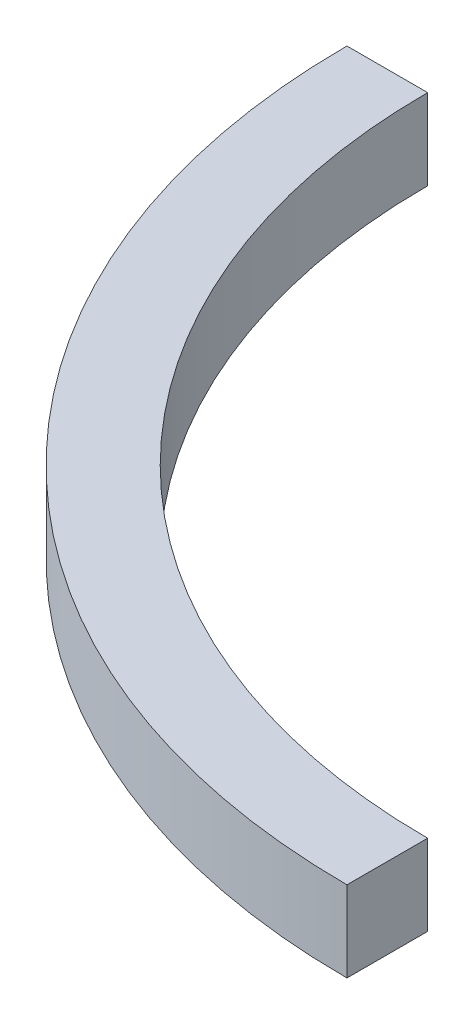
ISO-10303-21;
HEADER;
FILE_DESCRIPTION(('STEP AP214'),'2;1');
FILE_NAME('part.step','',(''),(''),'','','');
FILE_SCHEMA(('AUTOMOTIVE_DESIGN { 1 0 10303 214 1 1 1 1 }'));
ENDSEC;
DATA;
#1=APPLICATION_CONTEXT('core data for automotive mechanical design processes');
#2=APPLICATION_PROTOCOL_DEFINITION('international standard','automotive_design',2000,#1);
#3=PRODUCT_CONTEXT('',#1,'mechanical');
#4=PRODUCT('Part','Part','',(#3));
#5=PRODUCT_RELATED_PRODUCT_CATEGORY('part','',(#4));
#6=PRODUCT_DEFINITION_FORMATION('','',#4);
#7=PRODUCT_DEFINITION_CONTEXT('part definition',#1,'design');
#8=PRODUCT_DEFINITION('design','',#6,#7);
#9=PRODUCT_DEFINITION_SHAPE('','',#8);
#10=(LENGTH_UNIT() NAMED_UNIT(*) SI_UNIT(.MILLI.,.METRE.));
#11=(NAMED_UNIT(*) PLANE_ANGLE_UNIT() SI_UNIT($,.RADIAN.));
#12=(NAMED_UNIT(*) SI_UNIT($,.STERADIAN.) SOLID_ANGLE_UNIT());
#13=UNCERTAINTY_MEASURE_WITH_UNIT(LENGTH_MEASURE(1.E-05),#10,'distance_accuracy_value','');
#14=(GEOMETRIC_REPRESENTATION_CONTEXT(3) GLOBAL_UNCERTAINTY_ASSIGNED_CONTEXT((#13)) GLOBAL_UNIT_ASSIGNED_CONTEXT((#10,
#11,#12)) REPRESENTATION_CONTEXT('',''));
#15=CARTESIAN_POINT('',(0.,0.,0.));
#16=DIRECTION('',(0.,0.,1.));
#17=DIRECTION('',(1.,0.,0.));
#18=AXIS2_PLACEMENT_3D('',#15,#16,#17);
#19=CARTESIAN_POINT('',(0.,3.,0.));
#20=DIRECTION('',(0.,-1.,0.));
#21=DIRECTION('',(0.,0.,-1.));
#22=AXIS2_PLACEMENT_3D('',#19,#20,#21);
#23=CYLINDRICAL_SURFACE('',#22,27.);
#24=CARTESIAN_POINT('',(0.,0.,0.));
#25=DIRECTION('',(0.,1.,0.));
#26=DIRECTION('',(0.,0.,-1.));
#27=AXIS2_PLACEMENT_3D('',#24,#25,#26);
#28=CIRCLE('',#27,27.);
#29=CARTESIAN_POINT('',(-27.,0.,0.));
#30=VERTEX_POINT('',#29);
#31=CARTESIAN_POINT('',(0.,0.,27.));
#32=VERTEX_POINT('',#31);
#33=EDGE_CURVE('E107',#30,#32,#28,.T.);
#34=ORIENTED_EDGE('',*,*,#33,.T.);
#35=DIRECTION('',(0.,-1.,0.));
#36=VECTOR('',#35,1.);
#37=CARTESIAN_POINT('',(0.,3.,27.));
#38=LINE('',#37,#36);
#39=CARTESIAN_POINT('',(0.,3.,27.));
#40=VERTEX_POINT('',#39);
#41=EDGE_CURVE('E11',#40,#32,#38,.T.);
#42=ORIENTED_EDGE('',*,*,#41,.F.);
#43=CARTESIAN_POINT('',(0.,3.,0.));
#44=DIRECTION('',(0.,1.,0.));
#45=DIRECTION('',(0.,0.,-1.));
#46=AXIS2_PLACEMENT_3D('',#43,#44,#45);
#47=CIRCLE('',#46,27.);
#48=CARTESIAN_POINT('',(-27.,3.,0.));
#49=VERTEX_POINT('',#48);
#50=EDGE_CURVE('E91',#49,#40,#47,.T.);
#51=ORIENTED_EDGE('',*,*,#50,.F.);
#52=DIRECTION('',(0.,-1.,0.));
#53=VECTOR('',#52,1.);
#54=CARTESIAN_POINT('',(-27.,3.,0.));
#55=LINE('',#54,#53);
#56=EDGE_CURVE('E103',#49,#30,#55,.T.);
#57=ORIENTED_EDGE('',*,*,#56,.T.);
#58=EDGE_LOOP('',(#34,#42,#51,#57));
#59=FACE_BOUND('',#58,.T.);
#60=ADVANCED_FACE('F39',(#59),#23,.T.);
#61=CARTESIAN_POINT('',(0.,3.,24.));
#62=DIRECTION('',(-1.,0.,0.));
#63=DIRECTION('',(0.,0.,1.));
#64=AXIS2_PLACEMENT_3D('',#61,#62,#63);
#65=PLANE('',#64);
#66=DIRECTION('',(0.,0.,-1.));
#67=VECTOR('',#66,1.);
#68=CARTESIAN_POINT('',(0.,0.,24.));
#69=LINE('',#68,#67);
#70=CARTESIAN_POINT('',(0.,0.,24.));
#71=VERTEX_POINT('',#70);
#72=EDGE_CURVE('E96',#32,#71,#69,.T.);
#73=ORIENTED_EDGE('',*,*,#72,.T.);
#74=DIRECTION('',(0.,-1.,0.));
#75=VECTOR('',#74,1.);
#76=CARTESIAN_POINT('',(0.,3.,24.));
#77=LINE('',#76,#75);
#78=CARTESIAN_POINT('',(0.,3.,24.));
#79=VERTEX_POINT('',#78);
#80=EDGE_CURVE('E48',#79,#71,#77,.T.);
#81=ORIENTED_EDGE('',*,*,#80,.F.);
#82=DIRECTION('',(0.,0.,-1.));
#83=VECTOR('',#82,1.);
#84=CARTESIAN_POINT('',(0.,3.,24.));
#85=LINE('',#84,#83);
#86=EDGE_CURVE('E86',#40,#79,#85,.T.);
#87=ORIENTED_EDGE('',*,*,#86,.F.);
#88=ORIENTED_EDGE('',*,*,#41,.T.);
#89=EDGE_LOOP('',(#73,#81,#87,#88));
#90=FACE_BOUND('',#89,.T.);
#91=ADVANCED_FACE('F95',(#90),#65,.F.);
#92=CARTESIAN_POINT('',(0.,3.,0.));
#93=DIRECTION('',(0.,-1.,0.));
#94=DIRECTION('',(0.,0.,-1.));
#95=AXIS2_PLACEMENT_3D('',#92,#93,#94);
#96=CYLINDRICAL_SURFACE('',#95,24.);
#97=CARTESIAN_POINT('',(0.,0.,0.));
#98=DIRECTION('',(0.,-1.,0.));
#99=DIRECTION('',(0.,0.,-1.));
#100=AXIS2_PLACEMENT_3D('',#97,#98,#99);
#101=CIRCLE('',#100,24.);
#102=CARTESIAN_POINT('',(-24.,0.,0.));
#103=VERTEX_POINT('',#102);
#104=EDGE_CURVE('E73',#71,#103,#101,.T.);
#105=ORIENTED_EDGE('',*,*,#104,.T.);
#106=DIRECTION('',(0.,-1.,0.));
#107=VECTOR('',#106,1.);
#108=CARTESIAN_POINT('',(-24.,3.,0.));
#109=LINE('',#108,#107);
#110=CARTESIAN_POINT('',(-24.,3.,0.));
#111=VERTEX_POINT('',#110);
#112=EDGE_CURVE('E98',#111,#103,#109,.T.);
#113=ORIENTED_EDGE('',*,*,#112,.F.);
#114=CARTESIAN_POINT('',(0.,3.,0.));
#115=DIRECTION('',(0.,-1.,0.));
#116=DIRECTION('',(0.,0.,-1.));
#117=AXIS2_PLACEMENT_3D('',#114,#115,#116);
#118=CIRCLE('',#117,24.);
#119=EDGE_CURVE('E89',#79,#111,#118,.T.);
#120=ORIENTED_EDGE('',*,*,#119,.F.);
#121=ORIENTED_EDGE('',*,*,#80,.T.);
#122=EDGE_LOOP('',(#105,#113,#120,#121));
#123=FACE_BOUND('',#122,.T.);
#124=ADVANCED_FACE('F99',(#123),#96,.F.);
#125=CARTESIAN_POINT('',(-27.,3.,0.));
#126=DIRECTION('',(0.,0.,1.));
#127=DIRECTION('',(1.,0.,0.));
#128=AXIS2_PLACEMENT_3D('',#125,#126,#127);
#129=PLANE('',#128);
#130=DIRECTION('',(-1.,0.,0.));
#131=VECTOR('',#130,1.);
#132=CARTESIAN_POINT('',(-27.,0.,0.));
#133=LINE('',#132,#131);
#134=EDGE_CURVE('E79',#103,#30,#133,.T.);
#135=ORIENTED_EDGE('',*,*,#134,.T.);
#136=ORIENTED_EDGE('',*,*,#56,.F.);
#137=DIRECTION('',(-1.,0.,0.));
#138=VECTOR('',#137,1.);
#139=CARTESIAN_POINT('',(-27.,3.,0.));
#140=LINE('',#139,#138);
#141=EDGE_CURVE('E56',#111,#49,#140,.T.);
#142=ORIENTED_EDGE('',*,*,#141,.F.);
#143=ORIENTED_EDGE('',*,*,#112,.T.);
#144=EDGE_LOOP('',(#135,#136,#142,#143));
#145=FACE_BOUND('',#144,.T.);
#146=ADVANCED_FACE('F120',(#145),#129,.F.);
#147=CARTESIAN_POINT('',(0.,3.,0.));
#148=DIRECTION('',(0.,-1.,0.));
#149=DIRECTION('',(0.,0.,-1.));
#150=AXIS2_PLACEMENT_3D('',#147,#148,#149);
#151=PLANE('',#150);
#152=ORIENTED_EDGE('',*,*,#50,.T.);
#153=ORIENTED_EDGE('',*,*,#86,.T.);
#154=ORIENTED_EDGE('',*,*,#119,.T.);
#155=ORIENTED_EDGE('',*,*,#141,.T.);
#156=EDGE_LOOP('',(#152,#153,#154,#155));
#157=FACE_BOUND('',#156,.T.);
#158=ADVANCED_FACE('F87',(#157),#151,.F.);
#159=CARTESIAN_POINT('',(0.,0.,0.));
#160=DIRECTION('',(0.,-1.,0.));
#161=DIRECTION('',(0.,0.,-1.));
#162=AXIS2_PLACEMENT_3D('',#159,#160,#161);
#163=PLANE('',#162);
#164=ORIENTED_EDGE('',*,*,#33,.F.);
#165=ORIENTED_EDGE('',*,*,#134,.F.);
#166=ORIENTED_EDGE('',*,*,#104,.F.);
#167=ORIENTED_EDGE('',*,*,#72,.F.);
#168=EDGE_LOOP('',(#164,#165,#166,#167));
#169=FACE_BOUND('',#168,.T.);
#170=ADVANCED_FACE('F123',(#169),#163,.T.);
#171=CLOSED_SHELL('',(#60,#91,#124,#146,#158,#170));
#172=MANIFOLD_SOLID_BREP('B2',#171);
#173=ADVANCED_BREP_SHAPE_REPRESENTATION('',(#18,#172),#14);
#174=SHAPE_DEFINITION_REPRESENTATION(#9,#173);
ENDSEC;
END-ISO-10303-21;
